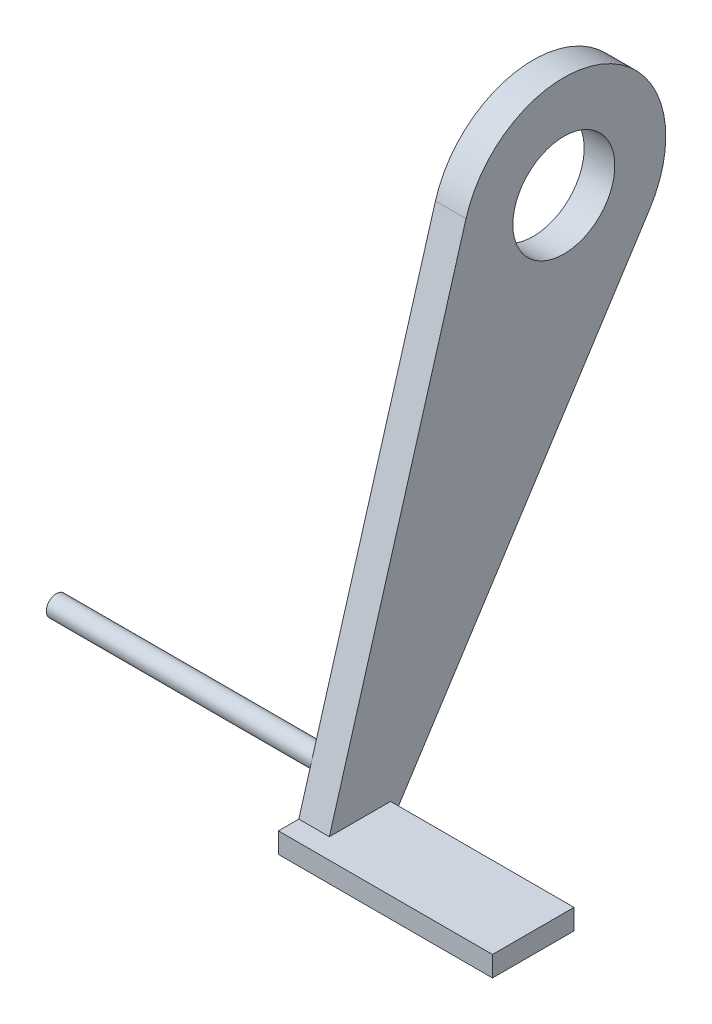
ISO-10303-21;
HEADER;
FILE_DESCRIPTION(('STEP AP214'),'2;1');
FILE_NAME('part.step','',(''),(''),'','','');
FILE_SCHEMA(('AUTOMOTIVE_DESIGN { 1 0 10303 214 1 1 1 1 }'));
ENDSEC;
DATA;
#1=APPLICATION_CONTEXT('core data for automotive mechanical design processes');
#2=APPLICATION_PROTOCOL_DEFINITION('international standard','automotive_design',2000,#1);
#3=PRODUCT_CONTEXT('',#1,'mechanical');
#4=PRODUCT('Part','Part','',(#3));
#5=PRODUCT_RELATED_PRODUCT_CATEGORY('part','',(#4));
#6=PRODUCT_DEFINITION_FORMATION('','',#4);
#7=PRODUCT_DEFINITION_CONTEXT('part definition',#1,'design');
#8=PRODUCT_DEFINITION('design','',#6,#7);
#9=PRODUCT_DEFINITION_SHAPE('','',#8);
#10=(LENGTH_UNIT() NAMED_UNIT(*) SI_UNIT(.MILLI.,.METRE.));
#11=(NAMED_UNIT(*) PLANE_ANGLE_UNIT() SI_UNIT($,.RADIAN.));
#12=(NAMED_UNIT(*) SI_UNIT($,.STERADIAN.) SOLID_ANGLE_UNIT());
#13=UNCERTAINTY_MEASURE_WITH_UNIT(LENGTH_MEASURE(1.E-05),#10,'distance_accuracy_value','');
#14=(GEOMETRIC_REPRESENTATION_CONTEXT(3) GLOBAL_UNCERTAINTY_ASSIGNED_CONTEXT((#13)) GLOBAL_UNIT_ASSIGNED_CONTEXT((#10,
#11,#12)) REPRESENTATION_CONTEXT('',''));
#15=CARTESIAN_POINT('',(0.,0.,0.));
#16=DIRECTION('',(0.,0.,1.));
#17=DIRECTION('',(1.,0.,0.));
#18=AXIS2_PLACEMENT_3D('',#15,#16,#17);
#19=CARTESIAN_POINT('',(5.334,-10.922,0.));
#20=DIRECTION('',(0.,1.,0.));
#21=DIRECTION('',(0.,0.,1.));
#22=AXIS2_PLACEMENT_3D('',#19,#20,#21);
#23=PLANE('',#22);
#24=DIRECTION('',(0.,0.,-1.));
#25=VECTOR('',#24,1.);
#26=CARTESIAN_POINT('',(0.762,-10.922,0.));
#27=LINE('',#26,#25);
#28=CARTESIAN_POINT('',(0.762,-10.922,5.842));
#29=VERTEX_POINT('',#28);
#30=CARTESIAN_POINT('',(0.762,-10.922,4.318));
#31=VERTEX_POINT('',#30);
#32=EDGE_CURVE('E166',#29,#31,#27,.T.);
#33=ORIENTED_EDGE('',*,*,#32,.F.);
#34=DIRECTION('',(-1.,0.,0.));
#35=VECTOR('',#34,1.);
#36=CARTESIAN_POINT('',(0.762,-10.922,5.842));
#37=LINE('',#36,#35);
#38=CARTESIAN_POINT('',(0.,-10.922,5.842));
#39=VERTEX_POINT('',#38);
#40=EDGE_CURVE('E138',#29,#39,#37,.T.);
#41=ORIENTED_EDGE('',*,*,#40,.T.);
#42=DIRECTION('',(0.,0.,-1.));
#43=VECTOR('',#42,1.);
#44=CARTESIAN_POINT('',(0.,-10.922,0.));
#45=LINE('',#44,#43);
#46=CARTESIAN_POINT('',(0.,-10.922,6.35));
#47=VERTEX_POINT('',#46);
#48=EDGE_CURVE('E128',#47,#39,#45,.T.);
#49=ORIENTED_EDGE('',*,*,#48,.F.);
#50=DIRECTION('',(-1.,0.,0.));
#51=VECTOR('',#50,1.);
#52=CARTESIAN_POINT('',(5.334,-10.922,6.35));
#53=LINE('',#52,#51);
#54=CARTESIAN_POINT('',(5.334,-10.922,6.35));
#55=VERTEX_POINT('',#54);
#56=EDGE_CURVE('E43',#55,#47,#53,.T.);
#57=ORIENTED_EDGE('',*,*,#56,.F.);
#58=DIRECTION('',(0.,0.,-1.));
#59=VECTOR('',#58,1.);
#60=CARTESIAN_POINT('',(5.334,-10.922,0.));
#61=LINE('',#60,#59);
#62=CARTESIAN_POINT('',(5.334,-10.922,4.318));
#63=VERTEX_POINT('',#62);
#64=EDGE_CURVE('E146',#55,#63,#61,.T.);
#65=ORIENTED_EDGE('',*,*,#64,.T.);
#66=DIRECTION('',(-1.,0.,0.));
#67=VECTOR('',#66,1.);
#68=CARTESIAN_POINT('',(5.334,-10.922,4.318));
#69=LINE('',#68,#67);
#70=EDGE_CURVE('E11',#63,#31,#69,.T.);
#71=ORIENTED_EDGE('',*,*,#70,.T.);
#72=EDGE_LOOP('',(#33,#41,#49,#57,#65,#71));
#73=FACE_BOUND('',#72,.T.);
#74=ADVANCED_FACE('F34',(#73),#23,.T.);
#75=CARTESIAN_POINT('',(5.334,0.,4.318));
#76=DIRECTION('',(0.,0.,-1.));
#77=DIRECTION('',(-1.,0.,0.));
#78=AXIS2_PLACEMENT_3D('',#75,#76,#77);
#79=PLANE('',#78);
#80=DIRECTION('',(0.,-1.,0.));
#81=VECTOR('',#80,1.);
#82=CARTESIAN_POINT('',(0.762,0.,4.318));
#83=LINE('',#82,#81);
#84=CARTESIAN_POINT('',(0.762,-11.43,4.318));
#85=VERTEX_POINT('',#84);
#86=EDGE_CURVE('E171',#31,#85,#83,.T.);
#87=ORIENTED_EDGE('',*,*,#86,.F.);
#88=ORIENTED_EDGE('',*,*,#70,.F.);
#89=DIRECTION('',(0.,-1.,0.));
#90=VECTOR('',#89,1.);
#91=CARTESIAN_POINT('',(5.334,0.,4.318));
#92=LINE('',#91,#90);
#93=CARTESIAN_POINT('',(5.334,-11.43,4.318));
#94=VERTEX_POINT('',#93);
#95=EDGE_CURVE('E144',#63,#94,#92,.T.);
#96=ORIENTED_EDGE('',*,*,#95,.T.);
#97=DIRECTION('',(-1.,0.,0.));
#98=VECTOR('',#97,1.);
#99=CARTESIAN_POINT('',(5.334,-11.43,4.318));
#100=LINE('',#99,#98);
#101=EDGE_CURVE('E153',#94,#85,#100,.T.);
#102=ORIENTED_EDGE('',*,*,#101,.T.);
#103=EDGE_LOOP('',(#87,#88,#96,#102));
#104=FACE_BOUND('',#103,.T.);
#105=ADVANCED_FACE('F36',(#104),#79,.T.);
#106=CARTESIAN_POINT('',(5.334,0.,6.35));
#107=DIRECTION('',(0.,0.,-1.));
#108=DIRECTION('',(-1.,0.,0.));
#109=AXIS2_PLACEMENT_3D('',#106,#107,#108);
#110=PLANE('',#109);
#111=DIRECTION('',(0.,-1.,0.));
#112=VECTOR('',#111,1.);
#113=CARTESIAN_POINT('',(0.,0.,6.35));
#114=LINE('',#113,#112);
#115=CARTESIAN_POINT('',(0.,-11.43,6.35));
#116=VERTEX_POINT('',#115);
#117=EDGE_CURVE('E65',#47,#116,#114,.T.);
#118=ORIENTED_EDGE('',*,*,#117,.T.);
#119=DIRECTION('',(-1.,0.,0.));
#120=VECTOR('',#119,1.);
#121=CARTESIAN_POINT('',(5.334,-11.43,6.35));
#122=LINE('',#121,#120);
#123=CARTESIAN_POINT('',(5.334,-11.43,6.35));
#124=VERTEX_POINT('',#123);
#125=EDGE_CURVE('E160',#124,#116,#122,.T.);
#126=ORIENTED_EDGE('',*,*,#125,.F.);
#127=DIRECTION('',(0.,-1.,0.));
#128=VECTOR('',#127,1.);
#129=CARTESIAN_POINT('',(5.334,0.,6.35));
#130=LINE('',#129,#128);
#131=EDGE_CURVE('E150',#55,#124,#130,.T.);
#132=ORIENTED_EDGE('',*,*,#131,.F.);
#133=ORIENTED_EDGE('',*,*,#56,.T.);
#134=EDGE_LOOP('',(#118,#126,#132,#133));
#135=FACE_BOUND('',#134,.T.);
#136=ADVANCED_FACE('F162',(#135),#110,.F.);
#137=CARTESIAN_POINT('',(5.334,-11.43,0.));
#138=DIRECTION('',(0.,1.,0.));
#139=DIRECTION('',(0.,0.,1.));
#140=AXIS2_PLACEMENT_3D('',#137,#138,#139);
#141=PLANE('',#140);
#142=DIRECTION('',(0.,0.,-1.));
#143=VECTOR('',#142,1.);
#144=CARTESIAN_POINT('',(0.,-11.43,0.));
#145=LINE('',#144,#143);
#146=CARTESIAN_POINT('',(0.,-11.43,4.318));
#147=VERTEX_POINT('',#146);
#148=EDGE_CURVE('E147',#116,#147,#145,.T.);
#149=ORIENTED_EDGE('',*,*,#148,.T.);
#150=DIRECTION('',(-1.,0.,0.));
#151=VECTOR('',#150,1.);
#152=CARTESIAN_POINT('',(0.762,-11.43,4.318));
#153=LINE('',#152,#151);
#154=EDGE_CURVE('E136',#85,#147,#153,.T.);
#155=ORIENTED_EDGE('',*,*,#154,.F.);
#156=ORIENTED_EDGE('',*,*,#101,.F.);
#157=DIRECTION('',(0.,0.,-1.));
#158=VECTOR('',#157,1.);
#159=CARTESIAN_POINT('',(5.334,-11.43,0.));
#160=LINE('',#159,#158);
#161=EDGE_CURVE('E51',#124,#94,#160,.T.);
#162=ORIENTED_EDGE('',*,*,#161,.F.);
#163=ORIENTED_EDGE('',*,*,#125,.T.);
#164=EDGE_LOOP('',(#149,#155,#156,#162,#163));
#165=FACE_BOUND('',#164,.T.);
#166=ADVANCED_FACE('F191',(#165),#141,.F.);
#167=CARTESIAN_POINT('',(5.334,0.,0.));
#168=DIRECTION('',(1.,0.,0.));
#169=DIRECTION('',(0.,0.,-1.));
#170=AXIS2_PLACEMENT_3D('',#167,#168,#169);
#171=PLANE('',#170);
#172=ORIENTED_EDGE('',*,*,#95,.F.);
#173=ORIENTED_EDGE('',*,*,#64,.F.);
#174=ORIENTED_EDGE('',*,*,#131,.T.);
#175=ORIENTED_EDGE('',*,*,#161,.T.);
#176=EDGE_LOOP('',(#172,#173,#174,#175));
#177=FACE_BOUND('',#176,.T.);
#178=ADVANCED_FACE('F192',(#177),#171,.T.);
#179=CARTESIAN_POINT('',(0.,0.,0.));
#180=DIRECTION('',(1.,0.,0.));
#181=DIRECTION('',(0.,0.,-1.));
#182=AXIS2_PLACEMENT_3D('',#179,#180,#181);
#183=PLANE('',#182);
#184=DIRECTION('',(0.,-0.959764981064111,0.280804524755222));
#185=VECTOR('',#184,1.);
#186=CARTESIAN_POINT('',(0.,0.713243492878265,2.43780305190284));
#187=LINE('',#186,#185);
#188=CARTESIAN_POINT('',(0.,-9.82345120621129,5.52059061536268));
#189=VERTEX_POINT('',#188);
#190=EDGE_CURVE('E114',#189,#39,#187,.T.);
#191=ORIENTED_EDGE('',*,*,#190,.F.);
#192=CARTESIAN_POINT('',(0.,-9.89477555549911,5.2768103101724));
#193=DIRECTION('',(-1.,0.,0.));
#194=DIRECTION('',(0.,0.,1.));
#195=AXIS2_PLACEMENT_3D('',#192,#193,#194);
#196=CIRCLE('',#195,0.254);
#197=EDGE_CURVE('E126',#189,#189,#196,.T.);
#198=ORIENTED_EDGE('',*,*,#197,.F.);
#199=CARTESIAN_POINT('',(0.,0.713243492878265,2.43780305190284));
#200=VERTEX_POINT('',#199);
#201=EDGE_CURVE('E110',#200,#189,#187,.T.);
#202=ORIENTED_EDGE('',*,*,#201,.F.);
#203=CARTESIAN_POINT('',(0.,0.,0.));
#204=DIRECTION('',(1.,0.,0.));
#205=DIRECTION('',(0.,0.,-1.));
#206=AXIS2_PLACEMENT_3D('',#203,#204,#205);
#207=CIRCLE('',#206,2.54);
#208=CARTESIAN_POINT('',(0.,-1.37197731646134,-2.13758701416236));
#209=VERTEX_POINT('',#208);
#210=EDGE_CURVE('E129',#209,#200,#207,.T.);
#211=ORIENTED_EDGE('',*,*,#210,.F.);
#212=DIRECTION('',(0.,-0.841569690615102,0.540148549787927));
#213=VECTOR('',#212,1.);
#214=CARTESIAN_POINT('',(0.,-1.37197731646134,-2.13758701416236));
#215=LINE('',#214,#213);
#216=EDGE_CURVE('E73',#209,#147,#215,.T.);
#217=ORIENTED_EDGE('',*,*,#216,.T.);
#218=ORIENTED_EDGE('',*,*,#148,.F.);
#219=ORIENTED_EDGE('',*,*,#117,.F.);
#220=ORIENTED_EDGE('',*,*,#48,.T.);
#221=EDGE_LOOP('',(#191,#198,#202,#211,#217,#218,#219,#220));
#222=FACE_BOUND('',#221,.T.);
#223=CARTESIAN_POINT('',(0.,0.,0.));
#224=DIRECTION('',(1.,0.,0.));
#225=DIRECTION('',(0.,0.,-1.));
#226=AXIS2_PLACEMENT_3D('',#223,#224,#225);
#227=CIRCLE('',#226,1.27);
#228=CARTESIAN_POINT('',(0.,0.,1.27));
#229=VERTEX_POINT('',#228);
#230=EDGE_CURVE('E120',#229,#229,#227,.T.);
#231=ORIENTED_EDGE('',*,*,#230,.T.);
#232=EDGE_LOOP('',(#231));
#233=FACE_BOUND('',#232,.T.);
#234=ADVANCED_FACE('F123',(#222,#233),#183,.F.);
#235=CARTESIAN_POINT('',(0.762,-1.37197731646134,-2.13758701416236));
#236=DIRECTION('',(0.,-0.540148549787927,-0.841569690615102));
#237=DIRECTION('',(0.,0.841569690615102,-0.540148549787927));
#238=AXIS2_PLACEMENT_3D('',#235,#236,#237);
#239=PLANE('',#238);
#240=ORIENTED_EDGE('',*,*,#216,.F.);
#241=DIRECTION('',(-1.,0.,0.));
#242=VECTOR('',#241,1.);
#243=CARTESIAN_POINT('',(0.762,-1.37197731646134,-2.13758701416236));
#244=LINE('',#243,#242);
#245=CARTESIAN_POINT('',(0.762,-1.37197731646134,-2.13758701416236));
#246=VERTEX_POINT('',#245);
#247=EDGE_CURVE('E142',#246,#209,#244,.T.);
#248=ORIENTED_EDGE('',*,*,#247,.F.);
#249=DIRECTION('',(0.,-0.841569690615102,0.540148549787927));
#250=VECTOR('',#249,1.);
#251=CARTESIAN_POINT('',(0.762,-1.37197731646134,-2.13758701416236));
#252=LINE('',#251,#250);
#253=EDGE_CURVE('E135',#246,#85,#252,.T.);
#254=ORIENTED_EDGE('',*,*,#253,.T.);
#255=ORIENTED_EDGE('',*,*,#154,.T.);
#256=EDGE_LOOP('',(#240,#248,#254,#255));
#257=FACE_BOUND('',#256,.T.);
#258=ADVANCED_FACE('F188',(#257),#239,.T.);
#259=CARTESIAN_POINT('',(0.762,0.,0.));
#260=DIRECTION('',(-1.,0.,0.));
#261=DIRECTION('',(0.,0.,1.));
#262=AXIS2_PLACEMENT_3D('',#259,#260,#261);
#263=CYLINDRICAL_SURFACE('',#262,2.54);
#264=ORIENTED_EDGE('',*,*,#210,.T.);
#265=DIRECTION('',(-1.,0.,0.));
#266=VECTOR('',#265,1.);
#267=CARTESIAN_POINT('',(0.762,0.713243492878265,2.43780305190284));
#268=LINE('',#267,#266);
#269=CARTESIAN_POINT('',(0.762,0.713243492878265,2.43780305190284));
#270=VERTEX_POINT('',#269);
#271=EDGE_CURVE('E118',#270,#200,#268,.T.);
#272=ORIENTED_EDGE('',*,*,#271,.F.);
#273=CARTESIAN_POINT('',(0.762,0.,0.));
#274=DIRECTION('',(1.,0.,0.));
#275=DIRECTION('',(0.,0.,-1.));
#276=AXIS2_PLACEMENT_3D('',#273,#274,#275);
#277=CIRCLE('',#276,2.54);
#278=EDGE_CURVE('E169',#246,#270,#277,.T.);
#279=ORIENTED_EDGE('',*,*,#278,.F.);
#280=ORIENTED_EDGE('',*,*,#247,.T.);
#281=EDGE_LOOP('',(#264,#272,#279,#280));
#282=FACE_BOUND('',#281,.T.);
#283=ADVANCED_FACE('F228',(#282),#263,.T.);
#284=CARTESIAN_POINT('',(0.762,0.713243492878265,2.43780305190284));
#285=DIRECTION('',(0.,-0.280804524755222,-0.959764981064111));
#286=DIRECTION('',(0.,0.959764981064111,-0.280804524755222));
#287=AXIS2_PLACEMENT_3D('',#284,#285,#286);
#288=PLANE('',#287);
#289=ORIENTED_EDGE('',*,*,#201,.T.);
#290=ORIENTED_EDGE('',*,*,#190,.T.);
#291=ORIENTED_EDGE('',*,*,#40,.F.);
#292=DIRECTION('',(0.,-0.959764981064111,0.280804524755222));
#293=VECTOR('',#292,1.);
#294=CARTESIAN_POINT('',(0.762,0.713243492878265,2.43780305190284));
#295=LINE('',#294,#293);
#296=EDGE_CURVE('E167',#270,#29,#295,.T.);
#297=ORIENTED_EDGE('',*,*,#296,.F.);
#298=ORIENTED_EDGE('',*,*,#271,.T.);
#299=EDGE_LOOP('',(#289,#290,#291,#297,#298));
#300=FACE_BOUND('',#299,.T.);
#301=ADVANCED_FACE('F112',(#300),#288,.F.);
#302=CARTESIAN_POINT('',(0.762,0.,0.));
#303=DIRECTION('',(-1.,0.,0.));
#304=DIRECTION('',(0.,0.,1.));
#305=AXIS2_PLACEMENT_3D('',#302,#303,#304);
#306=CYLINDRICAL_SURFACE('',#305,1.27);
#307=CARTESIAN_POINT('',(0.762,0.,0.));
#308=DIRECTION('',(1.,0.,0.));
#309=DIRECTION('',(0.,0.,-1.));
#310=AXIS2_PLACEMENT_3D('',#307,#308,#309);
#311=CIRCLE('',#310,1.27);
#312=CARTESIAN_POINT('',(0.762,0.,1.27));
#313=VERTEX_POINT('',#312);
#314=EDGE_CURVE('E139',#313,#313,#311,.T.);
#315=CARTESIAN_POINT('',(0.762,0.,1.27));
#316=CARTESIAN_POINT('',(0.7540625,0.,1.27));
#317=CARTESIAN_POINT('',(0.746125,0.,1.27));
#318=CARTESIAN_POINT('',(0.73025,0.,1.27));
#319=CARTESIAN_POINT('',(0.7223125,0.,1.27));
#320=CARTESIAN_POINT('',(0.7064375,0.,1.27));
#321=CARTESIAN_POINT('',(0.6985,0.,1.27));
#322=CARTESIAN_POINT('',(0.682625,0.,1.27));
#323=CARTESIAN_POINT('',(0.6746875,0.,1.27));
#324=CARTESIAN_POINT('',(0.6588125,0.,1.27));
#325=CARTESIAN_POINT('',(0.650875,0.,1.27));
#326=CARTESIAN_POINT('',(0.635,0.,1.27));
#327=CARTESIAN_POINT('',(0.6270625,0.,1.27));
#328=CARTESIAN_POINT('',(0.6111875,0.,1.27));
#329=CARTESIAN_POINT('',(0.60325,0.,1.27));
#330=CARTESIAN_POINT('',(0.587375,0.,1.27));
#331=CARTESIAN_POINT('',(0.5794375,0.,1.27));
#332=CARTESIAN_POINT('',(0.5635625,0.,1.27));
#333=CARTESIAN_POINT('',(0.555625,0.,1.27));
#334=CARTESIAN_POINT('',(0.53975,0.,1.27));
#335=CARTESIAN_POINT('',(0.5318125,0.,1.27));
#336=CARTESIAN_POINT('',(0.5159375,0.,1.27));
#337=CARTESIAN_POINT('',(0.508,0.,1.27));
#338=CARTESIAN_POINT('',(0.492125,0.,1.27));
#339=CARTESIAN_POINT('',(0.4841875,0.,1.27));
#340=CARTESIAN_POINT('',(0.4683125,0.,1.27));
#341=CARTESIAN_POINT('',(0.460375,0.,1.27));
#342=CARTESIAN_POINT('',(0.4445,0.,1.27));
#343=CARTESIAN_POINT('',(0.4365625,0.,1.27));
#344=CARTESIAN_POINT('',(0.4206875,0.,1.27));
#345=CARTESIAN_POINT('',(0.41275,0.,1.27));
#346=CARTESIAN_POINT('',(0.396875,0.,1.27));
#347=CARTESIAN_POINT('',(0.3889375,0.,1.27));
#348=CARTESIAN_POINT('',(0.3730625,0.,1.27));
#349=CARTESIAN_POINT('',(0.365125,0.,1.27));
#350=CARTESIAN_POINT('',(0.34925,0.,1.27));
#351=CARTESIAN_POINT('',(0.3413125,0.,1.27));
#352=CARTESIAN_POINT('',(0.3254375,0.,1.27));
#353=CARTESIAN_POINT('',(0.3175,0.,1.27));
#354=CARTESIAN_POINT('',(0.301625,0.,1.27));
#355=CARTESIAN_POINT('',(0.2936875,0.,1.27));
#356=CARTESIAN_POINT('',(0.2778125,0.,1.27));
#357=CARTESIAN_POINT('',(0.269875,0.,1.27));
#358=CARTESIAN_POINT('',(0.254,0.,1.27));
#359=CARTESIAN_POINT('',(0.2460625,0.,1.27));
#360=CARTESIAN_POINT('',(0.2301875,0.,1.27));
#361=CARTESIAN_POINT('',(0.22225,0.,1.27));
#362=CARTESIAN_POINT('',(0.206375,0.,1.27));
#363=CARTESIAN_POINT('',(0.1984375,0.,1.27));
#364=CARTESIAN_POINT('',(0.1825625,0.,1.27));
#365=CARTESIAN_POINT('',(0.174625,0.,1.27));
#366=CARTESIAN_POINT('',(0.15875,0.,1.27));
#367=CARTESIAN_POINT('',(0.1508125,0.,1.27));
#368=CARTESIAN_POINT('',(0.1349375,0.,1.27));
#369=CARTESIAN_POINT('',(0.127,0.,1.27));
#370=CARTESIAN_POINT('',(0.111125,0.,1.27));
#371=CARTESIAN_POINT('',(0.1031875,0.,1.27));
#372=CARTESIAN_POINT('',(0.0873125,0.,1.27));
#373=CARTESIAN_POINT('',(0.079375,0.,1.27));
#374=CARTESIAN_POINT('',(0.0635,0.,1.27));
#375=CARTESIAN_POINT('',(0.0555625,0.,1.27));
#376=CARTESIAN_POINT('',(0.0396875,0.,1.27));
#377=CARTESIAN_POINT('',(0.03175,0.,1.27));
#378=CARTESIAN_POINT('',(0.015875,0.,1.27));
#379=CARTESIAN_POINT('',(0.00793749999999999,0.,1.27));
#380=CARTESIAN_POINT('',(0.,0.,1.27));
#381=B_SPLINE_CURVE_WITH_KNOTS('',3,(#315,#316,#317,#318,#319,#320,#321,#322,#323,#324,#325,
#326,#327,#328,#329,#330,#331,#332,#333,#334,#335,#336,#337,#338,#339,#340,#341,#342,#343,#344,
#345,#346,#347,#348,#349,#350,#351,#352,#353,#354,#355,#356,#357,#358,#359,#360,#361,#362,#363,
#364,#365,#366,#367,#368,#369,#370,#371,#372,#373,#374,#375,#376,#377,#378,#379,#380),
.UNSPECIFIED.,.F.,.F.,(4,2,2,2,2,2,2,2,2,2,2,2,2,2,2,2,2,2,2,2,2,2,2,2,2,2,2,2,2,2,2,2,4),(0.,
0.0238125000000001,0.047625,0.0714375,0.0952500000000001,0.1190625,0.142875,0.1666875,0.1905,
0.2143125,0.238125,0.2619375,0.28575,0.3095625,0.333375,0.3571875,0.381,0.4048125,0.428625,
0.4524375,0.47625,0.5000625,0.523875,0.5476875,0.5715,0.5953125,0.619125,0.6429375,0.66675,
0.6905625,0.714375,0.7381875,0.762),.UNSPECIFIED.);
#382=EDGE_CURVE('BSEAM244',#313,#229,#381,.T.);
#383=ORIENTED_EDGE('',*,*,#314,.T.);
#384=ORIENTED_EDGE('',*,*,#230,.F.);
#385=ORIENTED_EDGE('',*,*,#382,.T.);
#386=ORIENTED_EDGE('',*,*,#382,.F.);
#387=EDGE_LOOP('',(#383,#385,#384,#386));
#388=FACE_BOUND('',#387,.T.);
#389=ADVANCED_FACE('F244',(#388),#306,.F.);
#390=CARTESIAN_POINT('',(0.762,0.,0.));
#391=DIRECTION('',(1.,0.,0.));
#392=DIRECTION('',(0.,0.,-1.));
#393=AXIS2_PLACEMENT_3D('',#390,#391,#392);
#394=PLANE('',#393);
#395=ORIENTED_EDGE('',*,*,#253,.F.);
#396=ORIENTED_EDGE('',*,*,#278,.T.);
#397=ORIENTED_EDGE('',*,*,#296,.T.);
#398=ORIENTED_EDGE('',*,*,#32,.T.);
#399=ORIENTED_EDGE('',*,*,#86,.T.);
#400=EDGE_LOOP('',(#395,#396,#397,#398,#399));
#401=FACE_BOUND('',#400,.T.);
#402=ORIENTED_EDGE('',*,*,#314,.F.);
#403=EDGE_LOOP('',(#402));
#404=FACE_BOUND('',#403,.T.);
#405=ADVANCED_FACE('F249',(#401,#404),#394,.T.);
#406=CARTESIAN_POINT('',(-6.604,-9.89477555549911,5.2768103101724));
#407=DIRECTION('',(1.,0.,0.));
#408=DIRECTION('',(0.,0.,-1.));
#409=AXIS2_PLACEMENT_3D('',#406,#407,#408);
#410=CYLINDRICAL_SURFACE('',#409,0.254);
#411=CARTESIAN_POINT('',(-6.604,-9.89477555549911,5.2768103101724));
#412=DIRECTION('',(-1.,0.,0.));
#413=DIRECTION('',(0.,0.,1.));
#414=AXIS2_PLACEMENT_3D('',#411,#412,#413);
#415=CIRCLE('',#414,0.254);
#416=CARTESIAN_POINT('',(-6.604,-9.89477555549911,5.5308103101724));
#417=VERTEX_POINT('',#416);
#418=EDGE_CURVE('E178',#417,#417,#415,.T.);
#419=ORIENTED_EDGE('',*,*,#418,.F.);
#420=EDGE_LOOP('',(#419));
#421=FACE_BOUND('',#420,.T.);
#422=ORIENTED_EDGE('',*,*,#197,.T.);
#423=EDGE_LOOP('',(#422));
#424=FACE_BOUND('',#423,.T.);
#425=ADVANCED_FACE('F260',(#421,#424),#410,.T.);
#426=CARTESIAN_POINT('',(-6.604,-9.89477555549911,5.2768103101724));
#427=DIRECTION('',(-1.,0.,0.));
#428=DIRECTION('',(0.,0.,1.));
#429=AXIS2_PLACEMENT_3D('',#426,#427,#428);
#430=PLANE('',#429);
#431=ORIENTED_EDGE('',*,*,#418,.T.);
#432=EDGE_LOOP('',(#431));
#433=FACE_BOUND('',#432,.T.);
#434=ADVANCED_FACE('F281',(#433),#430,.T.);
#435=CLOSED_SHELL('',(#74,#105,#136,#166,#178,#234,#258,#283,#301,#389,#405,#425,#434));
#436=MANIFOLD_SOLID_BREP('B2',#435);
#437=ADVANCED_BREP_SHAPE_REPRESENTATION('',(#18,#436),#14);
#438=SHAPE_DEFINITION_REPRESENTATION(#9,#437);
ENDSEC;
END-ISO-10303-21;
